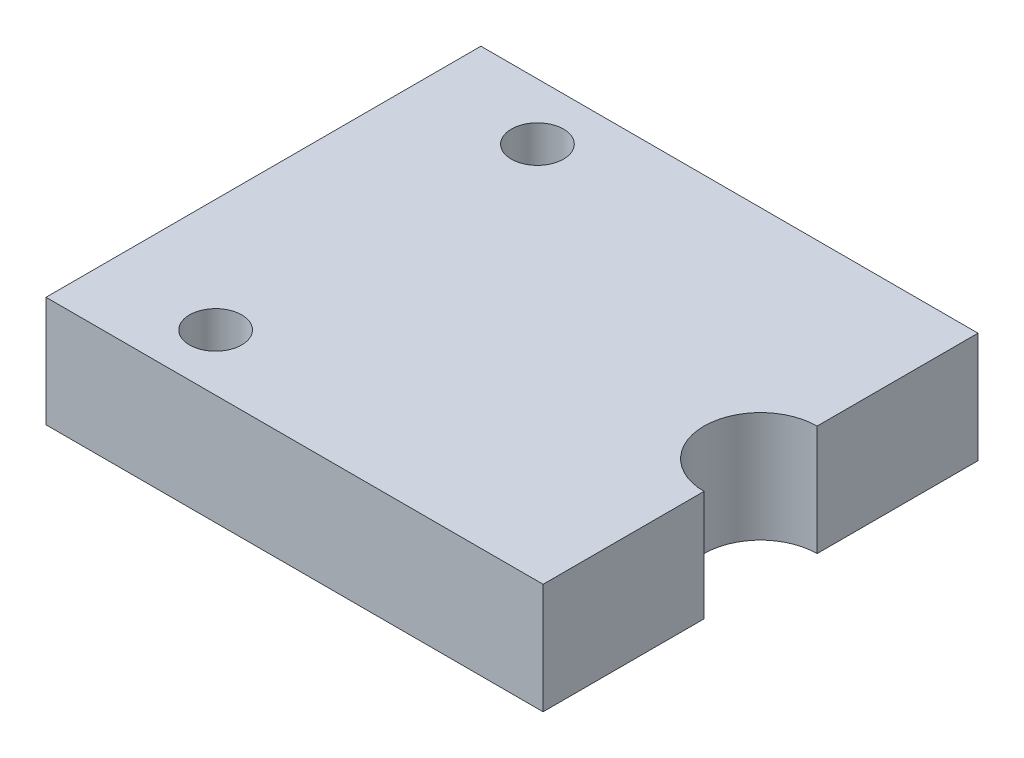
ISO-10303-21;
HEADER;
FILE_DESCRIPTION(('STEP AP214'),'2;1');
FILE_NAME('part.step','',(''),(''),'','','');
FILE_SCHEMA(('AUTOMOTIVE_DESIGN { 1 0 10303 214 1 1 1 1 }'));
ENDSEC;
DATA;
#1=APPLICATION_CONTEXT('core data for automotive mechanical design processes');
#2=APPLICATION_PROTOCOL_DEFINITION('international standard','automotive_design',2000,#1);
#3=PRODUCT_CONTEXT('',#1,'mechanical');
#4=PRODUCT('Part','Part','',(#3));
#5=PRODUCT_RELATED_PRODUCT_CATEGORY('part','',(#4));
#6=PRODUCT_DEFINITION_FORMATION('','',#4);
#7=PRODUCT_DEFINITION_CONTEXT('part definition',#1,'design');
#8=PRODUCT_DEFINITION('design','',#6,#7);
#9=PRODUCT_DEFINITION_SHAPE('','',#8);
#10=(LENGTH_UNIT() NAMED_UNIT(*) SI_UNIT(.MILLI.,.METRE.));
#11=(NAMED_UNIT(*) PLANE_ANGLE_UNIT() SI_UNIT($,.RADIAN.));
#12=(NAMED_UNIT(*) SI_UNIT($,.STERADIAN.) SOLID_ANGLE_UNIT());
#13=UNCERTAINTY_MEASURE_WITH_UNIT(LENGTH_MEASURE(1.E-05),#10,'distance_accuracy_value','');
#14=(GEOMETRIC_REPRESENTATION_CONTEXT(3) GLOBAL_UNCERTAINTY_ASSIGNED_CONTEXT((#13)) GLOBAL_UNIT_ASSIGNED_CONTEXT((#10,
#11,#12)) REPRESENTATION_CONTEXT('',''));
#15=CARTESIAN_POINT('',(0.,0.,0.));
#16=DIRECTION('',(0.,0.,1.));
#17=DIRECTION('',(1.,0.,0.));
#18=AXIS2_PLACEMENT_3D('',#15,#16,#17);
#19=CARTESIAN_POINT('',(0.,12.7,0.));
#20=DIRECTION('',(0.,1.,0.));
#21=DIRECTION('',(0.,0.,1.));
#22=AXIS2_PLACEMENT_3D('',#19,#20,#21);
#23=PLANE('',#22);
#24=CARTESIAN_POINT('',(-44.15,12.7,18.5));
#25=DIRECTION('',(0.,1.,0.));
#26=DIRECTION('',(0.,0.,1.));
#27=AXIS2_PLACEMENT_3D('',#24,#25,#26);
#28=CIRCLE('',#27,3.00000000000001);
#29=CARTESIAN_POINT('',(-44.15,12.7,21.5));
#30=VERTEX_POINT('',#29);
#31=EDGE_CURVE('E136',#30,#30,#28,.T.);
#32=ORIENTED_EDGE('',*,*,#31,.F.);
#33=EDGE_LOOP('',(#32));
#34=FACE_BOUND('',#33,.T.);
#35=DIRECTION('',(1.,0.,0.));
#36=VECTOR('',#35,1.);
#37=CARTESIAN_POINT('',(0.,12.7,25.));
#38=LINE('',#37,#36);
#39=CARTESIAN_POINT('',(-57.15,12.7,25.));
#40=VERTEX_POINT('',#39);
#41=CARTESIAN_POINT('',(0.,12.7,25.));
#42=VERTEX_POINT('',#41);
#43=EDGE_CURVE('E148',#40,#42,#38,.T.);
#44=ORIENTED_EDGE('',*,*,#43,.T.);
#45=DIRECTION('',(0.,0.,-1.));
#46=VECTOR('',#45,1.);
#47=CARTESIAN_POINT('',(0.,12.7,25.));
#48=LINE('',#47,#46);
#49=CARTESIAN_POINT('',(0.,12.7,6.5));
#50=VERTEX_POINT('',#49);
#51=EDGE_CURVE('E96',#42,#50,#48,.T.);
#52=ORIENTED_EDGE('',*,*,#51,.T.);
#53=CARTESIAN_POINT('',(0.,12.7,0.));
#54=DIRECTION('',(0.,-1.,0.));
#55=DIRECTION('',(0.,0.,1.));
#56=AXIS2_PLACEMENT_3D('',#53,#54,#55);
#57=CIRCLE('',#56,6.5);
#58=CARTESIAN_POINT('',(0.,12.7,-6.5));
#59=VERTEX_POINT('',#58);
#60=EDGE_CURVE('E109',#50,#59,#57,.T.);
#61=ORIENTED_EDGE('',*,*,#60,.T.);
#62=DIRECTION('',(0.,0.,-1.));
#63=VECTOR('',#62,1.);
#64=CARTESIAN_POINT('',(0.,12.7,-6.5));
#65=LINE('',#64,#63);
#66=CARTESIAN_POINT('',(0.,12.7,-25.));
#67=VERTEX_POINT('',#66);
#68=EDGE_CURVE('E103',#59,#67,#65,.T.);
#69=ORIENTED_EDGE('',*,*,#68,.T.);
#70=DIRECTION('',(-1.,0.,0.));
#71=VECTOR('',#70,1.);
#72=CARTESIAN_POINT('',(0.,12.7,-25.));
#73=LINE('',#72,#71);
#74=CARTESIAN_POINT('',(-57.15,12.7,-25.));
#75=VERTEX_POINT('',#74);
#76=EDGE_CURVE('E107',#67,#75,#73,.T.);
#77=ORIENTED_EDGE('',*,*,#76,.T.);
#78=DIRECTION('',(0.,0.,1.));
#79=VECTOR('',#78,1.);
#80=CARTESIAN_POINT('',(-57.15,12.7,-25.));
#81=LINE('',#80,#79);
#82=EDGE_CURVE('E59',#75,#40,#81,.T.);
#83=ORIENTED_EDGE('',*,*,#82,.T.);
#84=EDGE_LOOP('',(#44,#52,#61,#69,#77,#83));
#85=FACE_BOUND('',#84,.T.);
#86=CARTESIAN_POINT('',(-44.15,12.7,-18.5));
#87=DIRECTION('',(0.,1.,0.));
#88=DIRECTION('',(0.,0.,1.));
#89=AXIS2_PLACEMENT_3D('',#86,#87,#88);
#90=CIRCLE('',#89,3.00000000000001);
#91=CARTESIAN_POINT('',(-44.15,12.7,-15.5));
#92=VERTEX_POINT('',#91);
#93=EDGE_CURVE('E194',#92,#92,#90,.T.);
#94=ORIENTED_EDGE('',*,*,#93,.F.);
#95=EDGE_LOOP('',(#94));
#96=FACE_BOUND('',#95,.T.);
#97=ADVANCED_FACE('F41',(#34,#85,#96),#23,.T.);
#98=CARTESIAN_POINT('',(0.,0.,0.));
#99=DIRECTION('',(0.,1.,0.));
#100=DIRECTION('',(0.,0.,1.));
#101=AXIS2_PLACEMENT_3D('',#98,#99,#100);
#102=PLANE('',#101);
#103=DIRECTION('',(1.,0.,0.));
#104=VECTOR('',#103,1.);
#105=CARTESIAN_POINT('',(0.,0.,25.));
#106=LINE('',#105,#104);
#107=CARTESIAN_POINT('',(-57.15,0.,25.));
#108=VERTEX_POINT('',#107);
#109=CARTESIAN_POINT('',(0.,0.,25.));
#110=VERTEX_POINT('',#109);
#111=EDGE_CURVE('E131',#108,#110,#106,.T.);
#112=ORIENTED_EDGE('',*,*,#111,.F.);
#113=DIRECTION('',(0.,0.,1.));
#114=VECTOR('',#113,1.);
#115=CARTESIAN_POINT('',(-57.15,0.,-25.));
#116=LINE('',#115,#114);
#117=CARTESIAN_POINT('',(-57.15,0.,-25.));
#118=VERTEX_POINT('',#117);
#119=EDGE_CURVE('E88',#118,#108,#116,.T.);
#120=ORIENTED_EDGE('',*,*,#119,.F.);
#121=DIRECTION('',(-1.,0.,0.));
#122=VECTOR('',#121,1.);
#123=CARTESIAN_POINT('',(0.,0.,-25.));
#124=LINE('',#123,#122);
#125=CARTESIAN_POINT('',(0.,0.,-25.));
#126=VERTEX_POINT('',#125);
#127=EDGE_CURVE('E82',#126,#118,#124,.T.);
#128=ORIENTED_EDGE('',*,*,#127,.F.);
#129=DIRECTION('',(0.,0.,-1.));
#130=VECTOR('',#129,1.);
#131=CARTESIAN_POINT('',(0.,0.,-6.5));
#132=LINE('',#131,#130);
#133=CARTESIAN_POINT('',(0.,0.,-6.5));
#134=VERTEX_POINT('',#133);
#135=EDGE_CURVE('E118',#134,#126,#132,.T.);
#136=ORIENTED_EDGE('',*,*,#135,.F.);
#137=CARTESIAN_POINT('',(0.,0.,0.));
#138=DIRECTION('',(0.,-1.,0.));
#139=DIRECTION('',(0.,0.,1.));
#140=AXIS2_PLACEMENT_3D('',#137,#138,#139);
#141=CIRCLE('',#140,6.5);
#142=CARTESIAN_POINT('',(0.,0.,6.5));
#143=VERTEX_POINT('',#142);
#144=EDGE_CURVE('E139',#143,#134,#141,.T.);
#145=ORIENTED_EDGE('',*,*,#144,.F.);
#146=DIRECTION('',(0.,0.,-1.));
#147=VECTOR('',#146,1.);
#148=CARTESIAN_POINT('',(0.,0.,25.));
#149=LINE('',#148,#147);
#150=EDGE_CURVE('E135',#110,#143,#149,.T.);
#151=ORIENTED_EDGE('',*,*,#150,.F.);
#152=EDGE_LOOP('',(#112,#120,#128,#136,#145,#151));
#153=FACE_BOUND('',#152,.T.);
#154=CARTESIAN_POINT('',(-44.15,0.,18.5));
#155=DIRECTION('',(0.,1.,0.));
#156=DIRECTION('',(0.,0.,1.));
#157=AXIS2_PLACEMENT_3D('',#154,#155,#156);
#158=CIRCLE('',#157,3.00000000000001);
#159=CARTESIAN_POINT('',(-44.15,0.,21.5));
#160=VERTEX_POINT('',#159);
#161=EDGE_CURVE('E202',#160,#160,#158,.T.);
#162=ORIENTED_EDGE('',*,*,#161,.T.);
#163=EDGE_LOOP('',(#162));
#164=FACE_BOUND('',#163,.T.);
#165=CARTESIAN_POINT('',(-44.15,0.,-18.5));
#166=DIRECTION('',(0.,1.,0.));
#167=DIRECTION('',(0.,0.,1.));
#168=AXIS2_PLACEMENT_3D('',#165,#166,#167);
#169=CIRCLE('',#168,3.00000000000001);
#170=CARTESIAN_POINT('',(-44.15,0.,-15.5));
#171=VERTEX_POINT('',#170);
#172=EDGE_CURVE('E197',#171,#171,#169,.T.);
#173=ORIENTED_EDGE('',*,*,#172,.T.);
#174=EDGE_LOOP('',(#173));
#175=FACE_BOUND('',#174,.T.);
#176=ADVANCED_FACE('F161',(#153,#164,#175),#102,.F.);
#177=CARTESIAN_POINT('',(0.,12.7,25.));
#178=DIRECTION('',(0.,0.,-1.));
#179=DIRECTION('',(-1.,0.,0.));
#180=AXIS2_PLACEMENT_3D('',#177,#178,#179);
#181=PLANE('',#180);
#182=ORIENTED_EDGE('',*,*,#111,.T.);
#183=DIRECTION('',(0.,-1.,0.));
#184=VECTOR('',#183,1.);
#185=CARTESIAN_POINT('',(0.,12.7,25.));
#186=LINE('',#185,#184);
#187=EDGE_CURVE('E11',#42,#110,#186,.T.);
#188=ORIENTED_EDGE('',*,*,#187,.F.);
#189=ORIENTED_EDGE('',*,*,#43,.F.);
#190=DIRECTION('',(0.,-1.,0.));
#191=VECTOR('',#190,1.);
#192=CARTESIAN_POINT('',(-57.15,12.7,25.));
#193=LINE('',#192,#191);
#194=EDGE_CURVE('E127',#40,#108,#193,.T.);
#195=ORIENTED_EDGE('',*,*,#194,.T.);
#196=EDGE_LOOP('',(#182,#188,#189,#195));
#197=FACE_BOUND('',#196,.T.);
#198=ADVANCED_FACE('F43',(#197),#181,.F.);
#199=CARTESIAN_POINT('',(0.,12.7,25.));
#200=DIRECTION('',(-1.,0.,0.));
#201=DIRECTION('',(0.,0.,1.));
#202=AXIS2_PLACEMENT_3D('',#199,#200,#201);
#203=PLANE('',#202);
#204=ORIENTED_EDGE('',*,*,#150,.T.);
#205=DIRECTION('',(0.,-1.,0.));
#206=VECTOR('',#205,1.);
#207=CARTESIAN_POINT('',(0.,12.7,6.5));
#208=LINE('',#207,#206);
#209=EDGE_CURVE('E51',#50,#143,#208,.T.);
#210=ORIENTED_EDGE('',*,*,#209,.F.);
#211=ORIENTED_EDGE('',*,*,#51,.F.);
#212=ORIENTED_EDGE('',*,*,#187,.T.);
#213=EDGE_LOOP('',(#204,#210,#211,#212));
#214=FACE_BOUND('',#213,.T.);
#215=ADVANCED_FACE('F248',(#214),#203,.F.);
#216=CARTESIAN_POINT('',(0.,12.7,0.));
#217=DIRECTION('',(0.,-1.,0.));
#218=DIRECTION('',(0.,0.,-1.));
#219=AXIS2_PLACEMENT_3D('',#216,#217,#218);
#220=CYLINDRICAL_SURFACE('',#219,6.5);
#221=ORIENTED_EDGE('',*,*,#144,.T.);
#222=DIRECTION('',(0.,-1.,0.));
#223=VECTOR('',#222,1.);
#224=CARTESIAN_POINT('',(0.,12.7,-6.5));
#225=LINE('',#224,#223);
#226=EDGE_CURVE('E120',#59,#134,#225,.T.);
#227=ORIENTED_EDGE('',*,*,#226,.F.);
#228=ORIENTED_EDGE('',*,*,#60,.F.);
#229=ORIENTED_EDGE('',*,*,#209,.T.);
#230=EDGE_LOOP('',(#221,#227,#228,#229));
#231=FACE_BOUND('',#230,.T.);
#232=ADVANCED_FACE('F158',(#231),#220,.F.);
#233=CARTESIAN_POINT('',(0.,12.7,-6.5));
#234=DIRECTION('',(-1.,0.,0.));
#235=DIRECTION('',(0.,0.,1.));
#236=AXIS2_PLACEMENT_3D('',#233,#234,#235);
#237=PLANE('',#236);
#238=ORIENTED_EDGE('',*,*,#135,.T.);
#239=DIRECTION('',(0.,-1.,0.));
#240=VECTOR('',#239,1.);
#241=CARTESIAN_POINT('',(0.,12.7,-25.));
#242=LINE('',#241,#240);
#243=EDGE_CURVE('E115',#67,#126,#242,.T.);
#244=ORIENTED_EDGE('',*,*,#243,.F.);
#245=ORIENTED_EDGE('',*,*,#68,.F.);
#246=ORIENTED_EDGE('',*,*,#226,.T.);
#247=EDGE_LOOP('',(#238,#244,#245,#246));
#248=FACE_BOUND('',#247,.T.);
#249=ADVANCED_FACE('F116',(#248),#237,.F.);
#250=CARTESIAN_POINT('',(0.,12.7,-25.));
#251=DIRECTION('',(0.,0.,1.));
#252=DIRECTION('',(1.,0.,0.));
#253=AXIS2_PLACEMENT_3D('',#250,#251,#252);
#254=PLANE('',#253);
#255=ORIENTED_EDGE('',*,*,#127,.T.);
#256=DIRECTION('',(0.,-1.,0.));
#257=VECTOR('',#256,1.);
#258=CARTESIAN_POINT('',(-57.15,12.7,-25.));
#259=LINE('',#258,#257);
#260=EDGE_CURVE('E121',#75,#118,#259,.T.);
#261=ORIENTED_EDGE('',*,*,#260,.F.);
#262=ORIENTED_EDGE('',*,*,#76,.F.);
#263=ORIENTED_EDGE('',*,*,#243,.T.);
#264=EDGE_LOOP('',(#255,#261,#262,#263));
#265=FACE_BOUND('',#264,.T.);
#266=ADVANCED_FACE('F123',(#265),#254,.F.);
#267=CARTESIAN_POINT('',(-57.15,12.7,-25.));
#268=DIRECTION('',(1.,0.,0.));
#269=DIRECTION('',(0.,0.,-1.));
#270=AXIS2_PLACEMENT_3D('',#267,#268,#269);
#271=PLANE('',#270);
#272=ORIENTED_EDGE('',*,*,#119,.T.);
#273=ORIENTED_EDGE('',*,*,#194,.F.);
#274=ORIENTED_EDGE('',*,*,#82,.F.);
#275=ORIENTED_EDGE('',*,*,#260,.T.);
#276=EDGE_LOOP('',(#272,#273,#274,#275));
#277=FACE_BOUND('',#276,.T.);
#278=ADVANCED_FACE('F166',(#277),#271,.F.);
#279=CARTESIAN_POINT('',(-44.15,12.7,18.5));
#280=DIRECTION('',(0.,-1.,0.));
#281=DIRECTION('',(0.,0.,-1.));
#282=AXIS2_PLACEMENT_3D('',#279,#280,#281);
#283=CYLINDRICAL_SURFACE('',#282,3.00000000000001);
#284=ORIENTED_EDGE('',*,*,#31,.T.);
#285=EDGE_LOOP('',(#284));
#286=FACE_BOUND('',#285,.T.);
#287=ORIENTED_EDGE('',*,*,#161,.F.);
#288=EDGE_LOOP('',(#287));
#289=FACE_BOUND('',#288,.T.);
#290=ADVANCED_FACE('F168',(#286,#289),#283,.F.);
#291=CARTESIAN_POINT('',(-44.15,12.7,-18.5));
#292=DIRECTION('',(0.,-1.,0.));
#293=DIRECTION('',(0.,0.,-1.));
#294=AXIS2_PLACEMENT_3D('',#291,#292,#293);
#295=CYLINDRICAL_SURFACE('',#294,3.00000000000001);
#296=ORIENTED_EDGE('',*,*,#93,.T.);
#297=EDGE_LOOP('',(#296));
#298=FACE_BOUND('',#297,.T.);
#299=ORIENTED_EDGE('',*,*,#172,.F.);
#300=EDGE_LOOP('',(#299));
#301=FACE_BOUND('',#300,.T.);
#302=ADVANCED_FACE('F174',(#298,#301),#295,.F.);
#303=CLOSED_SHELL('',(#97,#176,#198,#215,#232,#249,#266,#278,#290,#302));
#304=MANIFOLD_SOLID_BREP('B2',#303);
#305=ADVANCED_BREP_SHAPE_REPRESENTATION('',(#18,#304),#14);
#306=SHAPE_DEFINITION_REPRESENTATION(#9,#305);
ENDSEC;
END-ISO-10303-21;
